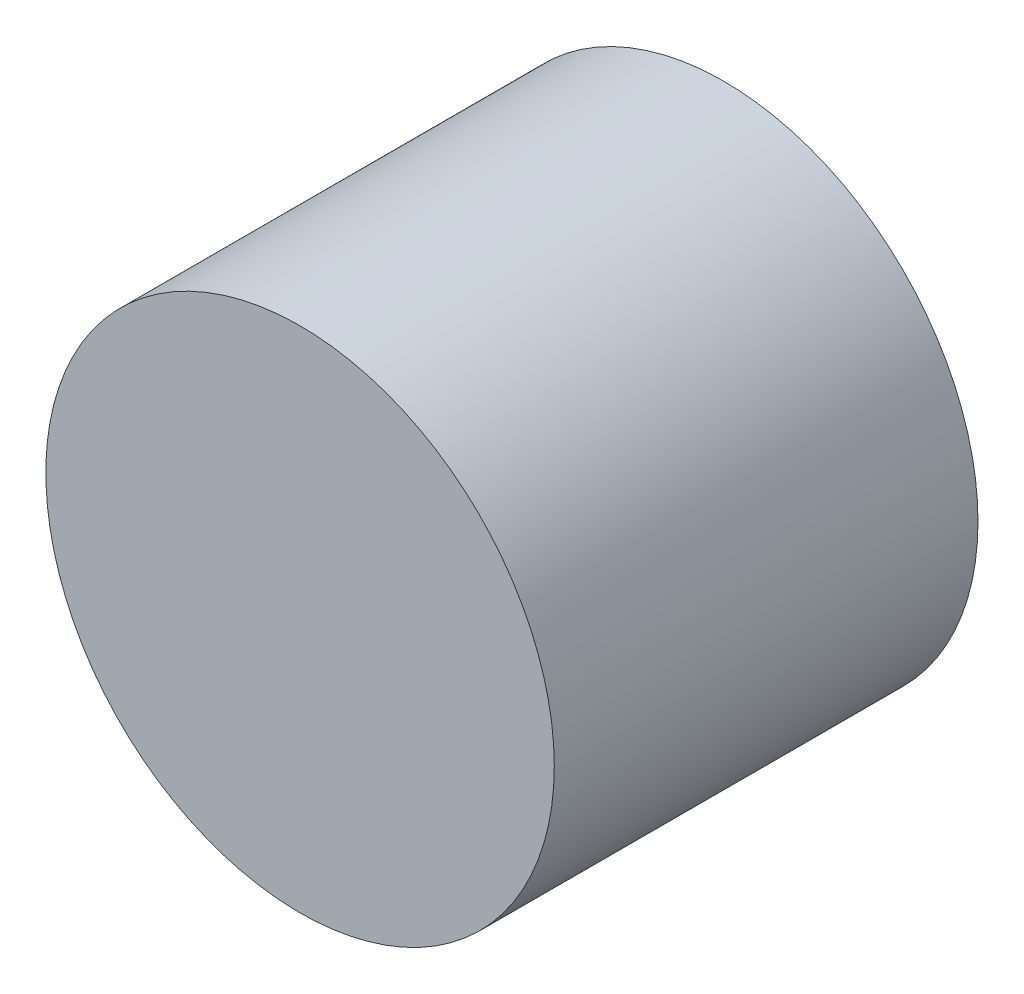
ISO-10303-21;
HEADER;
FILE_DESCRIPTION(('STEP AP214'),'2;1');
FILE_NAME('part.step','',(''),(''),'','','');
FILE_SCHEMA(('AUTOMOTIVE_DESIGN { 1 0 10303 214 1 1 1 1 }'));
ENDSEC;
DATA;
#1=APPLICATION_CONTEXT('core data for automotive mechanical design processes');
#2=APPLICATION_PROTOCOL_DEFINITION('international standard','automotive_design',2000,#1);
#3=PRODUCT_CONTEXT('',#1,'mechanical');
#4=PRODUCT('Part','Part','',(#3));
#5=PRODUCT_RELATED_PRODUCT_CATEGORY('part','',(#4));
#6=PRODUCT_DEFINITION_FORMATION('','',#4);
#7=PRODUCT_DEFINITION_CONTEXT('part definition',#1,'design');
#8=PRODUCT_DEFINITION('design','',#6,#7);
#9=PRODUCT_DEFINITION_SHAPE('','',#8);
#10=(LENGTH_UNIT() NAMED_UNIT(*) SI_UNIT(.MILLI.,.METRE.));
#11=(NAMED_UNIT(*) PLANE_ANGLE_UNIT() SI_UNIT($,.RADIAN.));
#12=(NAMED_UNIT(*) SI_UNIT($,.STERADIAN.) SOLID_ANGLE_UNIT());
#13=UNCERTAINTY_MEASURE_WITH_UNIT(LENGTH_MEASURE(1.E-05),#10,'distance_accuracy_value','');
#14=(GEOMETRIC_REPRESENTATION_CONTEXT(3) GLOBAL_UNCERTAINTY_ASSIGNED_CONTEXT((#13)) GLOBAL_UNIT_ASSIGNED_CONTEXT((#10,
#11,#12)) REPRESENTATION_CONTEXT('',''));
#15=CARTESIAN_POINT('',(0.,0.,0.));
#16=DIRECTION('',(0.,0.,1.));
#17=DIRECTION('',(1.,0.,0.));
#18=AXIS2_PLACEMENT_3D('',#15,#16,#17);
#19=CARTESIAN_POINT('',(0.,0.,50.));
#20=DIRECTION('',(0.,0.,-1.));
#21=DIRECTION('',(-1.,0.,0.));
#22=AXIS2_PLACEMENT_3D('',#19,#20,#21);
#23=CYLINDRICAL_SURFACE('',#22,30.);
#24=CARTESIAN_POINT('',(0.,0.,50.));
#25=DIRECTION('',(0.,0.,1.));
#26=DIRECTION('',(1.,0.,0.));
#27=AXIS2_PLACEMENT_3D('',#24,#25,#26);
#28=CIRCLE('',#27,30.);
#29=CARTESIAN_POINT('',(30.,0.,50.));
#30=VERTEX_POINT('',#29);
#31=EDGE_CURVE('E10',#30,#30,#28,.T.);
#32=ORIENTED_EDGE('',*,*,#31,.F.);
#33=EDGE_LOOP('',(#32));
#34=FACE_BOUND('',#33,.T.);
#35=CARTESIAN_POINT('',(0.,0.,0.));
#36=DIRECTION('',(0.,0.,1.));
#37=DIRECTION('',(1.,0.,0.));
#38=AXIS2_PLACEMENT_3D('',#35,#36,#37);
#39=CIRCLE('',#38,30.);
#40=CARTESIAN_POINT('',(30.,0.,0.));
#41=VERTEX_POINT('',#40);
#42=EDGE_CURVE('E42',#41,#41,#39,.T.);
#43=ORIENTED_EDGE('',*,*,#42,.T.);
#44=EDGE_LOOP('',(#43));
#45=FACE_BOUND('',#44,.T.);
#46=ADVANCED_FACE('F39',(#34,#45),#23,.T.);
#47=CARTESIAN_POINT('',(0.,0.,50.));
#48=DIRECTION('',(0.,0.,1.));
#49=DIRECTION('',(1.,0.,0.));
#50=AXIS2_PLACEMENT_3D('',#47,#48,#49);
#51=PLANE('',#50);
#52=ORIENTED_EDGE('',*,*,#31,.T.);
#53=EDGE_LOOP('',(#52));
#54=FACE_BOUND('',#53,.T.);
#55=ADVANCED_FACE('F54',(#54),#51,.T.);
#56=CARTESIAN_POINT('',(0.,0.,0.));
#57=DIRECTION('',(0.,0.,1.));
#58=DIRECTION('',(1.,0.,0.));
#59=AXIS2_PLACEMENT_3D('',#56,#57,#58);
#60=PLANE('',#59);
#61=ORIENTED_EDGE('',*,*,#42,.F.);
#62=EDGE_LOOP('',(#61));
#63=FACE_BOUND('',#62,.T.);
#64=ADVANCED_FACE('F52',(#63),#60,.F.);
#65=CLOSED_SHELL('',(#46,#55,#64));
#66=MANIFOLD_SOLID_BREP('B2',#65);
#67=ADVANCED_BREP_SHAPE_REPRESENTATION('',(#18,#66),#14);
#68=SHAPE_DEFINITION_REPRESENTATION(#9,#67);
ENDSEC;
END-ISO-10303-21;
